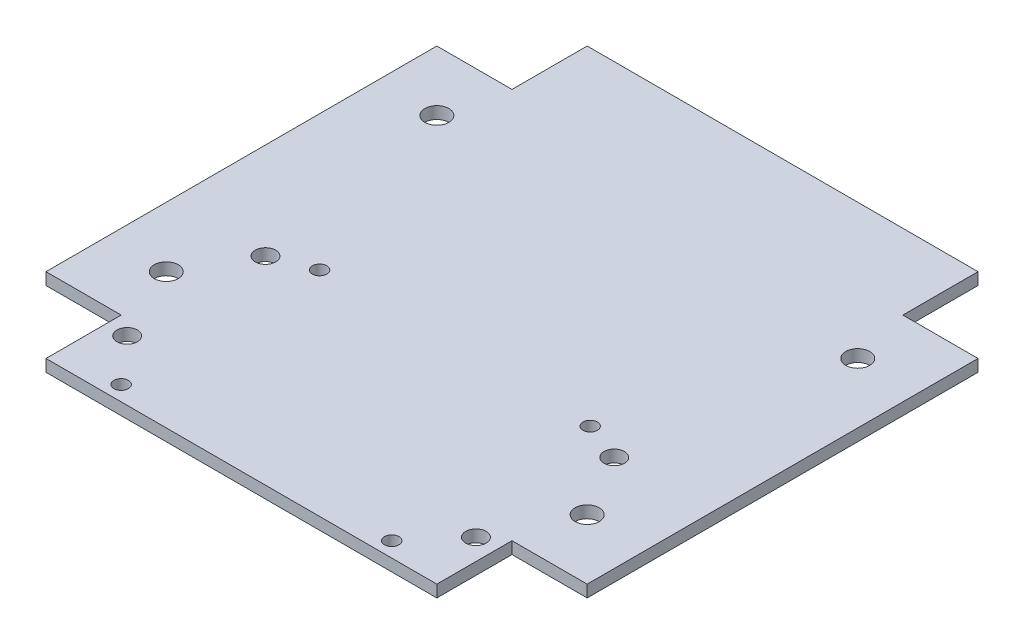
ISO-10303-21;
HEADER;
FILE_DESCRIPTION(('STEP AP214'),'2;1');
FILE_NAME('part.step','',(''),(''),'','','');
FILE_SCHEMA(('AUTOMOTIVE_DESIGN { 1 0 10303 214 1 1 1 1 }'));
ENDSEC;
DATA;
#1=APPLICATION_CONTEXT('core data for automotive mechanical design processes');
#2=APPLICATION_PROTOCOL_DEFINITION('international standard','automotive_design',2000,#1);
#3=PRODUCT_CONTEXT('',#1,'mechanical');
#4=PRODUCT('Part','Part','',(#3));
#5=PRODUCT_RELATED_PRODUCT_CATEGORY('part','',(#4));
#6=PRODUCT_DEFINITION_FORMATION('','',#4);
#7=PRODUCT_DEFINITION_CONTEXT('part definition',#1,'design');
#8=PRODUCT_DEFINITION('design','',#6,#7);
#9=PRODUCT_DEFINITION_SHAPE('','',#8);
#10=(LENGTH_UNIT() NAMED_UNIT(*) SI_UNIT(.MILLI.,.METRE.));
#11=(NAMED_UNIT(*) PLANE_ANGLE_UNIT() SI_UNIT($,.RADIAN.));
#12=(NAMED_UNIT(*) SI_UNIT($,.STERADIAN.) SOLID_ANGLE_UNIT());
#13=UNCERTAINTY_MEASURE_WITH_UNIT(LENGTH_MEASURE(1.E-05),#10,'distance_accuracy_value','');
#14=(GEOMETRIC_REPRESENTATION_CONTEXT(3) GLOBAL_UNCERTAINTY_ASSIGNED_CONTEXT((#13)) GLOBAL_UNIT_ASSIGNED_CONTEXT((#10,
#11,#12)) REPRESENTATION_CONTEXT('',''));
#15=CARTESIAN_POINT('',(0.,0.,0.));
#16=DIRECTION('',(0.,0.,1.));
#17=DIRECTION('',(1.,0.,0.));
#18=AXIS2_PLACEMENT_3D('',#15,#16,#17);
#19=CARTESIAN_POINT('',(0.,2.,0.));
#20=DIRECTION('',(0.,-1.,0.));
#21=DIRECTION('',(0.,0.,-1.));
#22=AXIS2_PLACEMENT_3D('',#19,#20,#21);
#23=PLANE('',#22);
#24=CARTESIAN_POINT('',(-31.4705882352941,2.,39.8897058823529));
#25=DIRECTION('',(0.,1.,0.));
#26=DIRECTION('',(0.,0.,1.));
#27=AXIS2_PLACEMENT_3D('',#24,#25,#26);
#28=CIRCLE('',#27,1.2);
#29=CARTESIAN_POINT('',(-31.4705882352941,2.,41.0897058823529));
#30=VERTEX_POINT('',#29);
#31=EDGE_CURVE('E231',#30,#30,#28,.T.);
#32=ORIENTED_EDGE('',*,*,#31,.F.);
#33=EDGE_LOOP('',(#32));
#34=FACE_BOUND('',#33,.T.);
#35=CARTESIAN_POINT('',(-31.4705882352941,2.,6.88970588235294));
#36=DIRECTION('',(0.,1.,0.));
#37=DIRECTION('',(0.,0.,1.));
#38=AXIS2_PLACEMENT_3D('',#35,#36,#37);
#39=CIRCLE('',#38,1.2);
#40=CARTESIAN_POINT('',(-31.4705882352941,2.,8.08970588235294));
#41=VERTEX_POINT('',#40);
#42=EDGE_CURVE('E221',#41,#41,#39,.T.);
#43=ORIENTED_EDGE('',*,*,#42,.F.);
#44=EDGE_LOOP('',(#43));
#45=FACE_BOUND('',#44,.T.);
#46=CARTESIAN_POINT('',(13.5294117647059,2.,39.8897058823529));
#47=DIRECTION('',(0.,1.,0.));
#48=DIRECTION('',(0.,0.,1.));
#49=AXIS2_PLACEMENT_3D('',#46,#47,#48);
#50=CIRCLE('',#49,1.2);
#51=CARTESIAN_POINT('',(13.5294117647059,2.,41.0897058823529));
#52=VERTEX_POINT('',#51);
#53=EDGE_CURVE('E218',#52,#52,#50,.T.);
#54=ORIENTED_EDGE('',*,*,#53,.F.);
#55=EDGE_LOOP('',(#54));
#56=FACE_BOUND('',#55,.T.);
#57=CARTESIAN_POINT('',(13.5294117647059,2.,6.88970588235294));
#58=DIRECTION('',(0.,1.,0.));
#59=DIRECTION('',(0.,0.,1.));
#60=AXIS2_PLACEMENT_3D('',#57,#58,#59);
#61=CIRCLE('',#60,1.2);
#62=CARTESIAN_POINT('',(13.5294117647059,2.,8.08970588235294));
#63=VERTEX_POINT('',#62);
#64=EDGE_CURVE('E215',#63,#63,#61,.T.);
#65=ORIENTED_EDGE('',*,*,#64,.F.);
#66=EDGE_LOOP('',(#65));
#67=FACE_BOUND('',#66,.T.);
#68=CARTESIAN_POINT('',(-37.9705882352941,2.,32.3897058823529));
#69=DIRECTION('',(0.,1.,0.));
#70=DIRECTION('',(0.,0.,1.));
#71=AXIS2_PLACEMENT_3D('',#68,#69,#70);
#72=CIRCLE('',#71,1.7);
#73=CARTESIAN_POINT('',(-37.9705882352941,2.,34.0897058823529));
#74=VERTEX_POINT('',#73);
#75=EDGE_CURVE('E210',#74,#74,#72,.T.);
#76=ORIENTED_EDGE('',*,*,#75,.F.);
#77=EDGE_LOOP('',(#76));
#78=FACE_BOUND('',#77,.T.);
#79=CARTESIAN_POINT('',(20.0294117647059,2.,32.3897058823529));
#80=DIRECTION('',(0.,1.,0.));
#81=DIRECTION('',(0.,0.,1.));
#82=AXIS2_PLACEMENT_3D('',#79,#80,#81);
#83=CIRCLE('',#82,1.7);
#84=CARTESIAN_POINT('',(20.0294117647059,2.,34.0897058823529));
#85=VERTEX_POINT('',#84);
#86=EDGE_CURVE('E243',#85,#85,#83,.T.);
#87=ORIENTED_EDGE('',*,*,#86,.F.);
#88=EDGE_LOOP('',(#87));
#89=FACE_BOUND('',#88,.T.);
#90=CARTESIAN_POINT('',(20.0294117647059,2.,9.38970588235295));
#91=DIRECTION('',(0.,1.,0.));
#92=DIRECTION('',(0.,0.,1.));
#93=AXIS2_PLACEMENT_3D('',#90,#91,#92);
#94=CIRCLE('',#93,1.7);
#95=CARTESIAN_POINT('',(20.0294117647059,2.,11.0897058823529));
#96=VERTEX_POINT('',#95);
#97=EDGE_CURVE('E206',#96,#96,#94,.T.);
#98=ORIENTED_EDGE('',*,*,#97,.F.);
#99=EDGE_LOOP('',(#98));
#100=FACE_BOUND('',#99,.T.);
#101=CARTESIAN_POINT('',(-43.9705882352941,2.,-25.1102941176471));
#102=DIRECTION('',(0.,1.,0.));
#103=DIRECTION('',(0.,0.,1.));
#104=AXIS2_PLACEMENT_3D('',#101,#102,#103);
#105=CIRCLE('',#104,1.99999999999999);
#106=CARTESIAN_POINT('',(-43.9705882352941,2.,-23.1102941176471));
#107=VERTEX_POINT('',#106);
#108=EDGE_CURVE('E205',#107,#107,#105,.T.);
#109=ORIENTED_EDGE('',*,*,#108,.F.);
#110=EDGE_LOOP('',(#109));
#111=FACE_BOUND('',#110,.T.);
#112=CARTESIAN_POINT('',(26.0294117647059,2.,-25.1102941176471));
#113=DIRECTION('',(0.,1.,0.));
#114=DIRECTION('',(0.,0.,1.));
#115=AXIS2_PLACEMENT_3D('',#112,#113,#114);
#116=CIRCLE('',#115,1.99999999999999);
#117=CARTESIAN_POINT('',(26.0294117647059,2.,-23.1102941176471));
#118=VERTEX_POINT('',#117);
#119=EDGE_CURVE('E256',#118,#118,#116,.T.);
#120=ORIENTED_EDGE('',*,*,#119,.F.);
#121=EDGE_LOOP('',(#120));
#122=FACE_BOUND('',#121,.T.);
#123=CARTESIAN_POINT('',(-43.9705882352941,2.,19.8897058823529));
#124=DIRECTION('',(0.,1.,0.));
#125=DIRECTION('',(0.,0.,1.));
#126=AXIS2_PLACEMENT_3D('',#123,#124,#125);
#127=CIRCLE('',#126,1.99999999999999);
#128=CARTESIAN_POINT('',(-43.9705882352941,2.,21.8897058823529));
#129=VERTEX_POINT('',#128);
#130=EDGE_CURVE('E262',#129,#129,#127,.T.);
#131=ORIENTED_EDGE('',*,*,#130,.F.);
#132=EDGE_LOOP('',(#131));
#133=FACE_BOUND('',#132,.T.);
#134=DIRECTION('',(0.,0.,1.));
#135=VECTOR('',#134,1.);
#136=CARTESIAN_POINT('',(-53.9705882352941,2.,29.8897058823529));
#137=LINE('',#136,#135);
#138=CARTESIAN_POINT('',(-53.9705882352941,2.,-35.1102941176471));
#139=VERTEX_POINT('',#138);
#140=CARTESIAN_POINT('',(-53.9705882352941,2.,29.8897058823529));
#141=VERTEX_POINT('',#140);
#142=EDGE_CURVE('E178',#139,#141,#137,.T.);
#143=ORIENTED_EDGE('',*,*,#142,.T.);
#144=DIRECTION('',(1.,0.,0.));
#145=VECTOR('',#144,1.);
#146=CARTESIAN_POINT('',(-41.4705882352941,2.,29.8897058823529));
#147=LINE('',#146,#145);
#148=CARTESIAN_POINT('',(-41.4705882352941,2.,29.8897058823529));
#149=VERTEX_POINT('',#148);
#150=EDGE_CURVE('E106',#141,#149,#147,.T.);
#151=ORIENTED_EDGE('',*,*,#150,.T.);
#152=DIRECTION('',(0.,0.,1.));
#153=VECTOR('',#152,1.);
#154=CARTESIAN_POINT('',(-41.4705882352941,2.,42.3897058823529));
#155=LINE('',#154,#153);
#156=CARTESIAN_POINT('',(-41.4705882352941,2.,42.3897058823529));
#157=VERTEX_POINT('',#156);
#158=EDGE_CURVE('E275',#149,#157,#155,.T.);
#159=ORIENTED_EDGE('',*,*,#158,.T.);
#160=DIRECTION('',(1.,0.,0.));
#161=VECTOR('',#160,1.);
#162=CARTESIAN_POINT('',(23.5294117647059,2.,42.3897058823529));
#163=LINE('',#162,#161);
#164=CARTESIAN_POINT('',(23.5294117647059,2.,42.3897058823529));
#165=VERTEX_POINT('',#164);
#166=EDGE_CURVE('E277',#157,#165,#163,.T.);
#167=ORIENTED_EDGE('',*,*,#166,.T.);
#168=DIRECTION('',(0.,0.,-1.));
#169=VECTOR('',#168,1.);
#170=CARTESIAN_POINT('',(23.5294117647059,2.,29.8897058823529));
#171=LINE('',#170,#169);
#172=CARTESIAN_POINT('',(23.5294117647059,2.,29.8897058823529));
#173=VERTEX_POINT('',#172);
#174=EDGE_CURVE('E279',#165,#173,#171,.T.);
#175=ORIENTED_EDGE('',*,*,#174,.T.);
#176=DIRECTION('',(1.,0.,0.));
#177=VECTOR('',#176,1.);
#178=CARTESIAN_POINT('',(36.0294117647059,2.,29.8897058823529));
#179=LINE('',#178,#177);
#180=CARTESIAN_POINT('',(36.0294117647059,2.,29.8897058823529));
#181=VERTEX_POINT('',#180);
#182=EDGE_CURVE('E281',#173,#181,#179,.T.);
#183=ORIENTED_EDGE('',*,*,#182,.T.);
#184=DIRECTION('',(0.,0.,-1.));
#185=VECTOR('',#184,1.);
#186=CARTESIAN_POINT('',(36.0294117647059,2.,-35.1102941176471));
#187=LINE('',#186,#185);
#188=CARTESIAN_POINT('',(36.0294117647059,2.,-35.1102941176471));
#189=VERTEX_POINT('',#188);
#190=EDGE_CURVE('E283',#181,#189,#187,.T.);
#191=ORIENTED_EDGE('',*,*,#190,.T.);
#192=DIRECTION('',(-1.,0.,0.));
#193=VECTOR('',#192,1.);
#194=CARTESIAN_POINT('',(23.5294117647059,2.,-35.1102941176471));
#195=LINE('',#194,#193);
#196=CARTESIAN_POINT('',(23.5294117647059,2.,-35.1102941176471));
#197=VERTEX_POINT('',#196);
#198=EDGE_CURVE('E285',#189,#197,#195,.T.);
#199=ORIENTED_EDGE('',*,*,#198,.T.);
#200=DIRECTION('',(0.,0.,-1.));
#201=VECTOR('',#200,1.);
#202=CARTESIAN_POINT('',(23.5294117647059,2.,-47.6102941176471));
#203=LINE('',#202,#201);
#204=CARTESIAN_POINT('',(23.5294117647059,2.,-47.6102941176471));
#205=VERTEX_POINT('',#204);
#206=EDGE_CURVE('E137',#197,#205,#203,.T.);
#207=ORIENTED_EDGE('',*,*,#206,.T.);
#208=DIRECTION('',(-1.,0.,0.));
#209=VECTOR('',#208,1.);
#210=CARTESIAN_POINT('',(-41.4705882352941,2.,-47.6102941176471));
#211=LINE('',#210,#209);
#212=CARTESIAN_POINT('',(-41.4705882352941,2.,-47.6102941176471));
#213=VERTEX_POINT('',#212);
#214=EDGE_CURVE('E131',#205,#213,#211,.T.);
#215=ORIENTED_EDGE('',*,*,#214,.T.);
#216=DIRECTION('',(0.,0.,1.));
#217=VECTOR('',#216,1.);
#218=CARTESIAN_POINT('',(-41.4705882352941,2.,-35.1102941176471));
#219=LINE('',#218,#217);
#220=CARTESIAN_POINT('',(-41.4705882352941,2.,-35.1102941176471));
#221=VERTEX_POINT('',#220);
#222=EDGE_CURVE('E135',#213,#221,#219,.T.);
#223=ORIENTED_EDGE('',*,*,#222,.T.);
#224=DIRECTION('',(-1.,0.,0.));
#225=VECTOR('',#224,1.);
#226=CARTESIAN_POINT('',(-53.9705882352941,2.,-35.1102941176471));
#227=LINE('',#226,#225);
#228=EDGE_CURVE('E51',#221,#139,#227,.T.);
#229=ORIENTED_EDGE('',*,*,#228,.T.);
#230=EDGE_LOOP('',(#143,#151,#159,#167,#175,#183,#191,#199,#207,#215,#223,#229));
#231=FACE_BOUND('',#230,.T.);
#232=CARTESIAN_POINT('',(26.0294117647059,2.,19.8897058823529));
#233=DIRECTION('',(0.,1.,0.));
#234=DIRECTION('',(0.,0.,1.));
#235=AXIS2_PLACEMENT_3D('',#232,#233,#234);
#236=CIRCLE('',#235,1.99999999999999);
#237=CARTESIAN_POINT('',(26.0294117647059,2.,21.8897058823529));
#238=VERTEX_POINT('',#237);
#239=EDGE_CURVE('E268',#238,#238,#236,.T.);
#240=ORIENTED_EDGE('',*,*,#239,.F.);
#241=EDGE_LOOP('',(#240));
#242=FACE_BOUND('',#241,.T.);
#243=CARTESIAN_POINT('',(-37.9705882352941,2.,9.38970588235295));
#244=DIRECTION('',(0.,1.,0.));
#245=DIRECTION('',(0.,0.,1.));
#246=AXIS2_PLACEMENT_3D('',#243,#244,#245);
#247=CIRCLE('',#246,1.7);
#248=CARTESIAN_POINT('',(-37.9705882352941,2.,11.0897058823529));
#249=VERTEX_POINT('',#248);
#250=EDGE_CURVE('E211',#249,#249,#247,.T.);
#251=ORIENTED_EDGE('',*,*,#250,.F.);
#252=EDGE_LOOP('',(#251));
#253=FACE_BOUND('',#252,.T.);
#254=ADVANCED_FACE('F32',(#34,#45,#56,#67,#78,#89,#100,#111,#122,#133,#231,#242,#253),#23,.F.);
#255=CARTESIAN_POINT('',(-53.9705882352941,2.,29.8897058823529));
#256=DIRECTION('',(1.,0.,0.));
#257=DIRECTION('',(0.,0.,-1.));
#258=AXIS2_PLACEMENT_3D('',#255,#256,#257);
#259=PLANE('',#258);
#260=DIRECTION('',(0.,0.,1.));
#261=VECTOR('',#260,1.);
#262=CARTESIAN_POINT('',(-53.9705882352941,0.,29.8897058823529));
#263=LINE('',#262,#261);
#264=CARTESIAN_POINT('',(-53.9705882352941,0.,-35.1102941176471));
#265=VERTEX_POINT('',#264);
#266=CARTESIAN_POINT('',(-53.9705882352941,0.,29.8897058823529));
#267=VERTEX_POINT('',#266);
#268=EDGE_CURVE('E155',#265,#267,#263,.T.);
#269=ORIENTED_EDGE('',*,*,#268,.T.);
#270=DIRECTION('',(0.,-1.,0.));
#271=VECTOR('',#270,1.);
#272=CARTESIAN_POINT('',(-53.9705882352941,2.,29.8897058823529));
#273=LINE('',#272,#271);
#274=EDGE_CURVE('E11',#141,#267,#273,.T.);
#275=ORIENTED_EDGE('',*,*,#274,.F.);
#276=ORIENTED_EDGE('',*,*,#142,.F.);
#277=DIRECTION('',(0.,-1.,0.));
#278=VECTOR('',#277,1.);
#279=CARTESIAN_POINT('',(-53.9705882352941,2.,-35.1102941176471));
#280=LINE('',#279,#278);
#281=EDGE_CURVE('E151',#139,#265,#280,.T.);
#282=ORIENTED_EDGE('',*,*,#281,.T.);
#283=EDGE_LOOP('',(#269,#275,#276,#282));
#284=FACE_BOUND('',#283,.T.);
#285=ADVANCED_FACE('F34',(#284),#259,.F.);
#286=CARTESIAN_POINT('',(-41.4705882352941,2.,29.8897058823529));
#287=DIRECTION('',(0.,0.,-1.));
#288=DIRECTION('',(-1.,0.,0.));
#289=AXIS2_PLACEMENT_3D('',#286,#287,#288);
#290=PLANE('',#289);
#291=DIRECTION('',(1.,0.,0.));
#292=VECTOR('',#291,1.);
#293=CARTESIAN_POINT('',(-41.4705882352941,0.,29.8897058823529));
#294=LINE('',#293,#292);
#295=CARTESIAN_POINT('',(-41.4705882352941,0.,29.8897058823529));
#296=VERTEX_POINT('',#295);
#297=EDGE_CURVE('E158',#267,#296,#294,.T.);
#298=ORIENTED_EDGE('',*,*,#297,.T.);
#299=DIRECTION('',(0.,-1.,0.));
#300=VECTOR('',#299,1.);
#301=CARTESIAN_POINT('',(-41.4705882352941,2.,29.8897058823529));
#302=LINE('',#301,#300);
#303=EDGE_CURVE('E42',#149,#296,#302,.T.);
#304=ORIENTED_EDGE('',*,*,#303,.F.);
#305=ORIENTED_EDGE('',*,*,#150,.F.);
#306=ORIENTED_EDGE('',*,*,#274,.T.);
#307=EDGE_LOOP('',(#298,#304,#305,#306));
#308=FACE_BOUND('',#307,.T.);
#309=ADVANCED_FACE('F320',(#308),#290,.F.);
#310=CARTESIAN_POINT('',(-41.4705882352941,2.,42.3897058823529));
#311=DIRECTION('',(1.,0.,0.));
#312=DIRECTION('',(0.,0.,-1.));
#313=AXIS2_PLACEMENT_3D('',#310,#311,#312);
#314=PLANE('',#313);
#315=DIRECTION('',(0.,0.,1.));
#316=VECTOR('',#315,1.);
#317=CARTESIAN_POINT('',(-41.4705882352941,0.,42.3897058823529));
#318=LINE('',#317,#316);
#319=CARTESIAN_POINT('',(-41.4705882352941,0.,42.3897058823529));
#320=VERTEX_POINT('',#319);
#321=EDGE_CURVE('E161',#296,#320,#318,.T.);
#322=ORIENTED_EDGE('',*,*,#321,.T.);
#323=DIRECTION('',(0.,-1.,0.));
#324=VECTOR('',#323,1.);
#325=CARTESIAN_POINT('',(-41.4705882352941,2.,42.3897058823529));
#326=LINE('',#325,#324);
#327=EDGE_CURVE('E197',#157,#320,#326,.T.);
#328=ORIENTED_EDGE('',*,*,#327,.F.);
#329=ORIENTED_EDGE('',*,*,#158,.F.);
#330=ORIENTED_EDGE('',*,*,#303,.T.);
#331=EDGE_LOOP('',(#322,#328,#329,#330));
#332=FACE_BOUND('',#331,.T.);
#333=ADVANCED_FACE('F568',(#332),#314,.F.);
#334=CARTESIAN_POINT('',(23.5294117647059,2.,42.3897058823529));
#335=DIRECTION('',(0.,0.,-1.));
#336=DIRECTION('',(-1.,0.,0.));
#337=AXIS2_PLACEMENT_3D('',#334,#335,#336);
#338=PLANE('',#337);
#339=DIRECTION('',(1.,0.,0.));
#340=VECTOR('',#339,1.);
#341=CARTESIAN_POINT('',(23.5294117647059,0.,42.3897058823529));
#342=LINE('',#341,#340);
#343=CARTESIAN_POINT('',(23.5294117647059,0.,42.3897058823529));
#344=VERTEX_POINT('',#343);
#345=EDGE_CURVE('E163',#320,#344,#342,.T.);
#346=ORIENTED_EDGE('',*,*,#345,.T.);
#347=DIRECTION('',(0.,-1.,0.));
#348=VECTOR('',#347,1.);
#349=CARTESIAN_POINT('',(23.5294117647059,2.,42.3897058823529));
#350=LINE('',#349,#348);
#351=EDGE_CURVE('E194',#165,#344,#350,.T.);
#352=ORIENTED_EDGE('',*,*,#351,.F.);
#353=ORIENTED_EDGE('',*,*,#166,.F.);
#354=ORIENTED_EDGE('',*,*,#327,.T.);
#355=EDGE_LOOP('',(#346,#352,#353,#354));
#356=FACE_BOUND('',#355,.T.);
#357=ADVANCED_FACE('F559',(#356),#338,.F.);
#358=CARTESIAN_POINT('',(23.5294117647059,2.,29.8897058823529));
#359=DIRECTION('',(-1.,0.,0.));
#360=DIRECTION('',(0.,0.,1.));
#361=AXIS2_PLACEMENT_3D('',#358,#359,#360);
#362=PLANE('',#361);
#363=DIRECTION('',(0.,0.,-1.));
#364=VECTOR('',#363,1.);
#365=CARTESIAN_POINT('',(23.5294117647059,0.,29.8897058823529));
#366=LINE('',#365,#364);
#367=CARTESIAN_POINT('',(23.5294117647059,0.,29.8897058823529));
#368=VERTEX_POINT('',#367);
#369=EDGE_CURVE('E165',#344,#368,#366,.T.);
#370=ORIENTED_EDGE('',*,*,#369,.T.);
#371=DIRECTION('',(0.,-1.,0.));
#372=VECTOR('',#371,1.);
#373=CARTESIAN_POINT('',(23.5294117647059,2.,29.8897058823529));
#374=LINE('',#373,#372);
#375=EDGE_CURVE('E191',#173,#368,#374,.T.);
#376=ORIENTED_EDGE('',*,*,#375,.F.);
#377=ORIENTED_EDGE('',*,*,#174,.F.);
#378=ORIENTED_EDGE('',*,*,#351,.T.);
#379=EDGE_LOOP('',(#370,#376,#377,#378));
#380=FACE_BOUND('',#379,.T.);
#381=ADVANCED_FACE('F550',(#380),#362,.F.);
#382=CARTESIAN_POINT('',(36.0294117647059,2.,29.8897058823529));
#383=DIRECTION('',(0.,0.,-1.));
#384=DIRECTION('',(-1.,0.,0.));
#385=AXIS2_PLACEMENT_3D('',#382,#383,#384);
#386=PLANE('',#385);
#387=DIRECTION('',(1.,0.,0.));
#388=VECTOR('',#387,1.);
#389=CARTESIAN_POINT('',(36.0294117647059,0.,29.8897058823529));
#390=LINE('',#389,#388);
#391=CARTESIAN_POINT('',(36.0294117647059,0.,29.8897058823529));
#392=VERTEX_POINT('',#391);
#393=EDGE_CURVE('E167',#368,#392,#390,.T.);
#394=ORIENTED_EDGE('',*,*,#393,.T.);
#395=DIRECTION('',(0.,-1.,0.));
#396=VECTOR('',#395,1.);
#397=CARTESIAN_POINT('',(36.0294117647059,2.,29.8897058823529));
#398=LINE('',#397,#396);
#399=EDGE_CURVE('E188',#181,#392,#398,.T.);
#400=ORIENTED_EDGE('',*,*,#399,.F.);
#401=ORIENTED_EDGE('',*,*,#182,.F.);
#402=ORIENTED_EDGE('',*,*,#375,.T.);
#403=EDGE_LOOP('',(#394,#400,#401,#402));
#404=FACE_BOUND('',#403,.T.);
#405=ADVANCED_FACE('F541',(#404),#386,.F.);
#406=CARTESIAN_POINT('',(36.0294117647059,2.,-35.1102941176471));
#407=DIRECTION('',(-1.,0.,0.));
#408=DIRECTION('',(0.,0.,1.));
#409=AXIS2_PLACEMENT_3D('',#406,#407,#408);
#410=PLANE('',#409);
#411=DIRECTION('',(0.,0.,-1.));
#412=VECTOR('',#411,1.);
#413=CARTESIAN_POINT('',(36.0294117647059,0.,-35.1102941176471));
#414=LINE('',#413,#412);
#415=CARTESIAN_POINT('',(36.0294117647059,0.,-35.1102941176471));
#416=VERTEX_POINT('',#415);
#417=EDGE_CURVE('E169',#392,#416,#414,.T.);
#418=ORIENTED_EDGE('',*,*,#417,.T.);
#419=DIRECTION('',(0.,-1.,0.));
#420=VECTOR('',#419,1.);
#421=CARTESIAN_POINT('',(36.0294117647059,2.,-35.1102941176471));
#422=LINE('',#421,#420);
#423=EDGE_CURVE('E185',#189,#416,#422,.T.);
#424=ORIENTED_EDGE('',*,*,#423,.F.);
#425=ORIENTED_EDGE('',*,*,#190,.F.);
#426=ORIENTED_EDGE('',*,*,#399,.T.);
#427=EDGE_LOOP('',(#418,#424,#425,#426));
#428=FACE_BOUND('',#427,.T.);
#429=ADVANCED_FACE('F533',(#428),#410,.F.);
#430=CARTESIAN_POINT('',(23.5294117647059,2.,-35.1102941176471));
#431=DIRECTION('',(0.,0.,1.));
#432=DIRECTION('',(1.,0.,0.));
#433=AXIS2_PLACEMENT_3D('',#430,#431,#432);
#434=PLANE('',#433);
#435=DIRECTION('',(-1.,0.,0.));
#436=VECTOR('',#435,1.);
#437=CARTESIAN_POINT('',(23.5294117647059,0.,-35.1102941176471));
#438=LINE('',#437,#436);
#439=CARTESIAN_POINT('',(23.5294117647059,0.,-35.1102941176471));
#440=VERTEX_POINT('',#439);
#441=EDGE_CURVE('E171',#416,#440,#438,.T.);
#442=ORIENTED_EDGE('',*,*,#441,.T.);
#443=DIRECTION('',(0.,-1.,0.));
#444=VECTOR('',#443,1.);
#445=CARTESIAN_POINT('',(23.5294117647059,2.,-35.1102941176471));
#446=LINE('',#445,#444);
#447=EDGE_CURVE('E182',#197,#440,#446,.T.);
#448=ORIENTED_EDGE('',*,*,#447,.F.);
#449=ORIENTED_EDGE('',*,*,#198,.F.);
#450=ORIENTED_EDGE('',*,*,#423,.T.);
#451=EDGE_LOOP('',(#442,#448,#449,#450));
#452=FACE_BOUND('',#451,.T.);
#453=ADVANCED_FACE('F291',(#452),#434,.F.);
#454=CARTESIAN_POINT('',(23.5294117647059,2.,-47.6102941176471));
#455=DIRECTION('',(-1.,0.,0.));
#456=DIRECTION('',(0.,0.,1.));
#457=AXIS2_PLACEMENT_3D('',#454,#455,#456);
#458=PLANE('',#457);
#459=DIRECTION('',(0.,0.,-1.));
#460=VECTOR('',#459,1.);
#461=CARTESIAN_POINT('',(23.5294117647059,0.,-47.6102941176471));
#462=LINE('',#461,#460);
#463=CARTESIAN_POINT('',(23.5294117647059,0.,-47.6102941176471));
#464=VERTEX_POINT('',#463);
#465=EDGE_CURVE('E173',#440,#464,#462,.T.);
#466=ORIENTED_EDGE('',*,*,#465,.T.);
#467=DIRECTION('',(0.,-1.,0.));
#468=VECTOR('',#467,1.);
#469=CARTESIAN_POINT('',(23.5294117647059,2.,-47.6102941176471));
#470=LINE('',#469,#468);
#471=EDGE_CURVE('E146',#205,#464,#470,.T.);
#472=ORIENTED_EDGE('',*,*,#471,.F.);
#473=ORIENTED_EDGE('',*,*,#206,.F.);
#474=ORIENTED_EDGE('',*,*,#447,.T.);
#475=EDGE_LOOP('',(#466,#472,#473,#474));
#476=FACE_BOUND('',#475,.T.);
#477=ADVANCED_FACE('F295',(#476),#458,.F.);
#478=CARTESIAN_POINT('',(-41.4705882352941,2.,-47.6102941176471));
#479=DIRECTION('',(0.,0.,1.));
#480=DIRECTION('',(1.,0.,0.));
#481=AXIS2_PLACEMENT_3D('',#478,#479,#480);
#482=PLANE('',#481);
#483=DIRECTION('',(-1.,0.,0.));
#484=VECTOR('',#483,1.);
#485=CARTESIAN_POINT('',(-41.4705882352941,0.,-47.6102941176471));
#486=LINE('',#485,#484);
#487=CARTESIAN_POINT('',(-41.4705882352941,0.,-47.6102941176471));
#488=VERTEX_POINT('',#487);
#489=EDGE_CURVE('E145',#464,#488,#486,.T.);
#490=ORIENTED_EDGE('',*,*,#489,.T.);
#491=DIRECTION('',(0.,-1.,0.));
#492=VECTOR('',#491,1.);
#493=CARTESIAN_POINT('',(-41.4705882352941,2.,-47.6102941176471));
#494=LINE('',#493,#492);
#495=EDGE_CURVE('E142',#213,#488,#494,.T.);
#496=ORIENTED_EDGE('',*,*,#495,.F.);
#497=ORIENTED_EDGE('',*,*,#214,.F.);
#498=ORIENTED_EDGE('',*,*,#471,.T.);
#499=EDGE_LOOP('',(#490,#496,#497,#498));
#500=FACE_BOUND('',#499,.T.);
#501=ADVANCED_FACE('F143',(#500),#482,.F.);
#502=CARTESIAN_POINT('',(-41.4705882352941,2.,-35.1102941176471));
#503=DIRECTION('',(1.,0.,0.));
#504=DIRECTION('',(0.,0.,-1.));
#505=AXIS2_PLACEMENT_3D('',#502,#503,#504);
#506=PLANE('',#505);
#507=DIRECTION('',(0.,0.,1.));
#508=VECTOR('',#507,1.);
#509=CARTESIAN_POINT('',(-41.4705882352941,0.,-35.1102941176471));
#510=LINE('',#509,#508);
#511=CARTESIAN_POINT('',(-41.4705882352941,0.,-35.1102941176471));
#512=VERTEX_POINT('',#511);
#513=EDGE_CURVE('E92',#488,#512,#510,.T.);
#514=ORIENTED_EDGE('',*,*,#513,.T.);
#515=DIRECTION('',(0.,-1.,0.));
#516=VECTOR('',#515,1.);
#517=CARTESIAN_POINT('',(-41.4705882352941,2.,-35.1102941176471));
#518=LINE('',#517,#516);
#519=EDGE_CURVE('E147',#221,#512,#518,.T.);
#520=ORIENTED_EDGE('',*,*,#519,.F.);
#521=ORIENTED_EDGE('',*,*,#222,.F.);
#522=ORIENTED_EDGE('',*,*,#495,.T.);
#523=EDGE_LOOP('',(#514,#520,#521,#522));
#524=FACE_BOUND('',#523,.T.);
#525=ADVANCED_FACE('F149',(#524),#506,.F.);
#526=CARTESIAN_POINT('',(-53.9705882352941,2.,-35.1102941176471));
#527=DIRECTION('',(0.,0.,1.));
#528=DIRECTION('',(1.,0.,0.));
#529=AXIS2_PLACEMENT_3D('',#526,#527,#528);
#530=PLANE('',#529);
#531=DIRECTION('',(-1.,0.,0.));
#532=VECTOR('',#531,1.);
#533=CARTESIAN_POINT('',(-53.9705882352941,0.,-35.1102941176471));
#534=LINE('',#533,#532);
#535=EDGE_CURVE('E98',#512,#265,#534,.T.);
#536=ORIENTED_EDGE('',*,*,#535,.T.);
#537=ORIENTED_EDGE('',*,*,#281,.F.);
#538=ORIENTED_EDGE('',*,*,#228,.F.);
#539=ORIENTED_EDGE('',*,*,#519,.T.);
#540=EDGE_LOOP('',(#536,#537,#538,#539));
#541=FACE_BOUND('',#540,.T.);
#542=ADVANCED_FACE('F303',(#541),#530,.F.);
#543=CARTESIAN_POINT('',(0.,0.,0.));
#544=DIRECTION('',(0.,-1.,0.));
#545=DIRECTION('',(0.,0.,-1.));
#546=AXIS2_PLACEMENT_3D('',#543,#544,#545);
#547=PLANE('',#546);
#548=CARTESIAN_POINT('',(-31.4705882352941,0.,39.8897058823529));
#549=DIRECTION('',(0.,-1.,0.));
#550=DIRECTION('',(0.,0.,-1.));
#551=AXIS2_PLACEMENT_3D('',#548,#549,#550);
#552=CIRCLE('',#551,1.2);
#553=CARTESIAN_POINT('',(-31.4705882352941,0.,38.6897058823529));
#554=VERTEX_POINT('',#553);
#555=EDGE_CURVE('E36',#554,#554,#552,.T.);
#556=ORIENTED_EDGE('',*,*,#555,.F.);
#557=EDGE_LOOP('',(#556));
#558=FACE_BOUND('',#557,.T.);
#559=CARTESIAN_POINT('',(-31.4705882352941,0.,6.88970588235294));
#560=DIRECTION('',(0.,-1.,0.));
#561=DIRECTION('',(0.,0.,-1.));
#562=AXIS2_PLACEMENT_3D('',#559,#560,#561);
#563=CIRCLE('',#562,1.2);
#564=CARTESIAN_POINT('',(-31.4705882352941,0.,5.68970588235294));
#565=VERTEX_POINT('',#564);
#566=EDGE_CURVE('E219',#565,#565,#563,.T.);
#567=ORIENTED_EDGE('',*,*,#566,.F.);
#568=EDGE_LOOP('',(#567));
#569=FACE_BOUND('',#568,.T.);
#570=CARTESIAN_POINT('',(13.5294117647059,0.,39.8897058823529));
#571=DIRECTION('',(0.,-1.,0.));
#572=DIRECTION('',(0.,0.,-1.));
#573=AXIS2_PLACEMENT_3D('',#570,#571,#572);
#574=CIRCLE('',#573,1.2);
#575=CARTESIAN_POINT('',(13.5294117647059,0.,38.6897058823529));
#576=VERTEX_POINT('',#575);
#577=EDGE_CURVE('E216',#576,#576,#574,.T.);
#578=ORIENTED_EDGE('',*,*,#577,.F.);
#579=EDGE_LOOP('',(#578));
#580=FACE_BOUND('',#579,.T.);
#581=CARTESIAN_POINT('',(13.5294117647059,0.,6.88970588235294));
#582=DIRECTION('',(0.,-1.,0.));
#583=DIRECTION('',(0.,0.,-1.));
#584=AXIS2_PLACEMENT_3D('',#581,#582,#583);
#585=CIRCLE('',#584,1.2);
#586=CARTESIAN_POINT('',(13.5294117647059,0.,5.68970588235294));
#587=VERTEX_POINT('',#586);
#588=EDGE_CURVE('E212',#587,#587,#585,.T.);
#589=ORIENTED_EDGE('',*,*,#588,.F.);
#590=EDGE_LOOP('',(#589));
#591=FACE_BOUND('',#590,.T.);
#592=CARTESIAN_POINT('',(-37.9705882352941,0.,9.38970588235295));
#593=DIRECTION('',(0.,-1.,0.));
#594=DIRECTION('',(0.,0.,-1.));
#595=AXIS2_PLACEMENT_3D('',#592,#593,#594);
#596=CIRCLE('',#595,1.7);
#597=CARTESIAN_POINT('',(-37.9705882352941,0.,7.68970588235295));
#598=VERTEX_POINT('',#597);
#599=EDGE_CURVE('E207',#598,#598,#596,.T.);
#600=ORIENTED_EDGE('',*,*,#599,.F.);
#601=EDGE_LOOP('',(#600));
#602=FACE_BOUND('',#601,.T.);
#603=CARTESIAN_POINT('',(-37.9705882352941,0.,32.3897058823529));
#604=DIRECTION('',(0.,-1.,0.));
#605=DIRECTION('',(0.,0.,-1.));
#606=AXIS2_PLACEMENT_3D('',#603,#604,#605);
#607=CIRCLE('',#606,1.7);
#608=CARTESIAN_POINT('',(-37.9705882352941,0.,30.6897058823529));
#609=VERTEX_POINT('',#608);
#610=EDGE_CURVE('E240',#609,#609,#607,.T.);
#611=ORIENTED_EDGE('',*,*,#610,.F.);
#612=EDGE_LOOP('',(#611));
#613=FACE_BOUND('',#612,.T.);
#614=CARTESIAN_POINT('',(20.0294117647059,0.,32.3897058823529));
#615=DIRECTION('',(0.,-1.,0.));
#616=DIRECTION('',(0.,0.,-1.));
#617=AXIS2_PLACEMENT_3D('',#614,#615,#616);
#618=CIRCLE('',#617,1.7);
#619=CARTESIAN_POINT('',(20.0294117647059,0.,30.6897058823529));
#620=VERTEX_POINT('',#619);
#621=EDGE_CURVE('E246',#620,#620,#618,.T.);
#622=ORIENTED_EDGE('',*,*,#621,.F.);
#623=EDGE_LOOP('',(#622));
#624=FACE_BOUND('',#623,.T.);
#625=CARTESIAN_POINT('',(20.0294117647059,0.,9.38970588235295));
#626=DIRECTION('',(0.,-1.,0.));
#627=DIRECTION('',(0.,0.,-1.));
#628=AXIS2_PLACEMENT_3D('',#625,#626,#627);
#629=CIRCLE('',#628,1.7);
#630=CARTESIAN_POINT('',(20.0294117647059,0.,7.68970588235295));
#631=VERTEX_POINT('',#630);
#632=EDGE_CURVE('E202',#631,#631,#629,.T.);
#633=ORIENTED_EDGE('',*,*,#632,.F.);
#634=EDGE_LOOP('',(#633));
#635=FACE_BOUND('',#634,.T.);
#636=CARTESIAN_POINT('',(-43.9705882352941,0.,-25.1102941176471));
#637=DIRECTION('',(0.,1.,0.));
#638=DIRECTION('',(0.,0.,1.));
#639=AXIS2_PLACEMENT_3D('',#636,#637,#638);
#640=CIRCLE('',#639,2.);
#641=CARTESIAN_POINT('',(-43.9705882352941,0.,-23.1102941176471));
#642=VERTEX_POINT('',#641);
#643=EDGE_CURVE('E253',#642,#642,#640,.T.);
#644=ORIENTED_EDGE('',*,*,#643,.T.);
#645=EDGE_LOOP('',(#644));
#646=FACE_BOUND('',#645,.T.);
#647=CARTESIAN_POINT('',(26.0294117647059,0.,-25.1102941176471));
#648=DIRECTION('',(0.,1.,0.));
#649=DIRECTION('',(0.,0.,1.));
#650=AXIS2_PLACEMENT_3D('',#647,#648,#649);
#651=CIRCLE('',#650,2.);
#652=CARTESIAN_POINT('',(26.0294117647059,0.,-23.1102941176471));
#653=VERTEX_POINT('',#652);
#654=EDGE_CURVE('E259',#653,#653,#651,.T.);
#655=ORIENTED_EDGE('',*,*,#654,.T.);
#656=EDGE_LOOP('',(#655));
#657=FACE_BOUND('',#656,.T.);
#658=CARTESIAN_POINT('',(-43.9705882352941,0.,19.8897058823529));
#659=DIRECTION('',(0.,1.,0.));
#660=DIRECTION('',(0.,0.,1.));
#661=AXIS2_PLACEMENT_3D('',#658,#659,#660);
#662=CIRCLE('',#661,2.);
#663=CARTESIAN_POINT('',(-43.9705882352941,0.,21.8897058823529));
#664=VERTEX_POINT('',#663);
#665=EDGE_CURVE('E265',#664,#664,#662,.T.);
#666=ORIENTED_EDGE('',*,*,#665,.T.);
#667=EDGE_LOOP('',(#666));
#668=FACE_BOUND('',#667,.T.);
#669=CARTESIAN_POINT('',(26.0294117647059,0.,19.8897058823529));
#670=DIRECTION('',(0.,1.,0.));
#671=DIRECTION('',(0.,0.,1.));
#672=AXIS2_PLACEMENT_3D('',#669,#670,#671);
#673=CIRCLE('',#672,2.);
#674=CARTESIAN_POINT('',(26.0294117647059,0.,21.8897058823529));
#675=VERTEX_POINT('',#674);
#676=EDGE_CURVE('E159',#675,#675,#673,.T.);
#677=ORIENTED_EDGE('',*,*,#676,.T.);
#678=EDGE_LOOP('',(#677));
#679=FACE_BOUND('',#678,.T.);
#680=ORIENTED_EDGE('',*,*,#268,.F.);
#681=ORIENTED_EDGE('',*,*,#535,.F.);
#682=ORIENTED_EDGE('',*,*,#513,.F.);
#683=ORIENTED_EDGE('',*,*,#489,.F.);
#684=ORIENTED_EDGE('',*,*,#465,.F.);
#685=ORIENTED_EDGE('',*,*,#441,.F.);
#686=ORIENTED_EDGE('',*,*,#417,.F.);
#687=ORIENTED_EDGE('',*,*,#393,.F.);
#688=ORIENTED_EDGE('',*,*,#369,.F.);
#689=ORIENTED_EDGE('',*,*,#345,.F.);
#690=ORIENTED_EDGE('',*,*,#321,.F.);
#691=ORIENTED_EDGE('',*,*,#297,.F.);
#692=EDGE_LOOP('',(#680,#681,#682,#683,#684,#685,#686,#687,#688,#689,#690,#691));
#693=FACE_BOUND('',#692,.T.);
#694=ADVANCED_FACE('F298',(#558,#569,#580,#591,#602,#613,#624,#635,#646,#657,#668,#679,#693),
#547,.T.);
#695=CARTESIAN_POINT('',(26.0294117647059,2.,19.8897058823529));
#696=DIRECTION('',(0.,1.,0.));
#697=DIRECTION('',(0.,0.,1.));
#698=AXIS2_PLACEMENT_3D('',#695,#696,#697);
#699=CYLINDRICAL_SURFACE('',#698,1.99999999999999);
#700=ORIENTED_EDGE('',*,*,#676,.F.);
#701=EDGE_LOOP('',(#700));
#702=FACE_BOUND('',#701,.T.);
#703=ORIENTED_EDGE('',*,*,#239,.T.);
#704=EDGE_LOOP('',(#703));
#705=FACE_BOUND('',#704,.T.);
#706=ADVANCED_FACE('F310',(#702,#705),#699,.F.);
#707=CARTESIAN_POINT('',(-43.9705882352941,2.,19.8897058823529));
#708=DIRECTION('',(0.,1.,0.));
#709=DIRECTION('',(0.,0.,1.));
#710=AXIS2_PLACEMENT_3D('',#707,#708,#709);
#711=CYLINDRICAL_SURFACE('',#710,1.99999999999999);
#712=ORIENTED_EDGE('',*,*,#665,.F.);
#713=EDGE_LOOP('',(#712));
#714=FACE_BOUND('',#713,.T.);
#715=ORIENTED_EDGE('',*,*,#130,.T.);
#716=EDGE_LOOP('',(#715));
#717=FACE_BOUND('',#716,.T.);
#718=ADVANCED_FACE('F326',(#714,#717),#711,.F.);
#719=CARTESIAN_POINT('',(26.0294117647059,2.,-25.1102941176471));
#720=DIRECTION('',(0.,1.,0.));
#721=DIRECTION('',(0.,0.,1.));
#722=AXIS2_PLACEMENT_3D('',#719,#720,#721);
#723=CYLINDRICAL_SURFACE('',#722,1.99999999999999);
#724=ORIENTED_EDGE('',*,*,#654,.F.);
#725=EDGE_LOOP('',(#724));
#726=FACE_BOUND('',#725,.T.);
#727=ORIENTED_EDGE('',*,*,#119,.T.);
#728=EDGE_LOOP('',(#727));
#729=FACE_BOUND('',#728,.T.);
#730=ADVANCED_FACE('F330',(#726,#729),#723,.F.);
#731=CARTESIAN_POINT('',(-43.9705882352941,2.,-25.1102941176471));
#732=DIRECTION('',(0.,1.,0.));
#733=DIRECTION('',(0.,0.,1.));
#734=AXIS2_PLACEMENT_3D('',#731,#732,#733);
#735=CYLINDRICAL_SURFACE('',#734,1.99999999999999);
#736=ORIENTED_EDGE('',*,*,#643,.F.);
#737=EDGE_LOOP('',(#736));
#738=FACE_BOUND('',#737,.T.);
#739=ORIENTED_EDGE('',*,*,#108,.T.);
#740=EDGE_LOOP('',(#739));
#741=FACE_BOUND('',#740,.T.);
#742=ADVANCED_FACE('F334',(#738,#741),#735,.F.);
#743=CARTESIAN_POINT('',(20.0294117647059,2.,9.38970588235295));
#744=DIRECTION('',(0.,1.,0.));
#745=DIRECTION('',(0.,0.,1.));
#746=AXIS2_PLACEMENT_3D('',#743,#744,#745);
#747=CYLINDRICAL_SURFACE('',#746,1.7);
#748=ORIENTED_EDGE('',*,*,#632,.T.);
#749=EDGE_LOOP('',(#748));
#750=FACE_BOUND('',#749,.T.);
#751=ORIENTED_EDGE('',*,*,#97,.T.);
#752=EDGE_LOOP('',(#751));
#753=FACE_BOUND('',#752,.T.);
#754=ADVANCED_FACE('F338',(#750,#753),#747,.F.);
#755=CARTESIAN_POINT('',(20.0294117647059,2.,32.3897058823529));
#756=DIRECTION('',(0.,1.,0.));
#757=DIRECTION('',(0.,0.,1.));
#758=AXIS2_PLACEMENT_3D('',#755,#756,#757);
#759=CYLINDRICAL_SURFACE('',#758,1.7);
#760=ORIENTED_EDGE('',*,*,#621,.T.);
#761=EDGE_LOOP('',(#760));
#762=FACE_BOUND('',#761,.T.);
#763=ORIENTED_EDGE('',*,*,#86,.T.);
#764=EDGE_LOOP('',(#763));
#765=FACE_BOUND('',#764,.T.);
#766=ADVANCED_FACE('F342',(#762,#765),#759,.F.);
#767=CARTESIAN_POINT('',(-37.9705882352941,2.,32.3897058823529));
#768=DIRECTION('',(0.,1.,0.));
#769=DIRECTION('',(0.,0.,1.));
#770=AXIS2_PLACEMENT_3D('',#767,#768,#769);
#771=CYLINDRICAL_SURFACE('',#770,1.7);
#772=ORIENTED_EDGE('',*,*,#610,.T.);
#773=EDGE_LOOP('',(#772));
#774=FACE_BOUND('',#773,.T.);
#775=ORIENTED_EDGE('',*,*,#75,.T.);
#776=EDGE_LOOP('',(#775));
#777=FACE_BOUND('',#776,.T.);
#778=ADVANCED_FACE('F346',(#774,#777),#771,.F.);
#779=CARTESIAN_POINT('',(-37.9705882352941,2.,9.38970588235295));
#780=DIRECTION('',(0.,1.,0.));
#781=DIRECTION('',(0.,0.,1.));
#782=AXIS2_PLACEMENT_3D('',#779,#780,#781);
#783=CYLINDRICAL_SURFACE('',#782,1.7);
#784=ORIENTED_EDGE('',*,*,#599,.T.);
#785=EDGE_LOOP('',(#784));
#786=FACE_BOUND('',#785,.T.);
#787=ORIENTED_EDGE('',*,*,#250,.T.);
#788=EDGE_LOOP('',(#787));
#789=FACE_BOUND('',#788,.T.);
#790=ADVANCED_FACE('F350',(#786,#789),#783,.F.);
#791=CARTESIAN_POINT('',(13.5294117647059,2.,6.88970588235294));
#792=DIRECTION('',(0.,1.,0.));
#793=DIRECTION('',(0.,0.,1.));
#794=AXIS2_PLACEMENT_3D('',#791,#792,#793);
#795=CYLINDRICAL_SURFACE('',#794,1.2);
#796=ORIENTED_EDGE('',*,*,#588,.T.);
#797=EDGE_LOOP('',(#796));
#798=FACE_BOUND('',#797,.T.);
#799=ORIENTED_EDGE('',*,*,#64,.T.);
#800=EDGE_LOOP('',(#799));
#801=FACE_BOUND('',#800,.T.);
#802=ADVANCED_FACE('F354',(#798,#801),#795,.F.);
#803=CARTESIAN_POINT('',(13.5294117647059,2.,39.8897058823529));
#804=DIRECTION('',(0.,1.,0.));
#805=DIRECTION('',(0.,0.,1.));
#806=AXIS2_PLACEMENT_3D('',#803,#804,#805);
#807=CYLINDRICAL_SURFACE('',#806,1.2);
#808=ORIENTED_EDGE('',*,*,#577,.T.);
#809=EDGE_LOOP('',(#808));
#810=FACE_BOUND('',#809,.T.);
#811=ORIENTED_EDGE('',*,*,#53,.T.);
#812=EDGE_LOOP('',(#811));
#813=FACE_BOUND('',#812,.T.);
#814=ADVANCED_FACE('F358',(#810,#813),#807,.F.);
#815=CARTESIAN_POINT('',(-31.4705882352941,2.,6.88970588235294));
#816=DIRECTION('',(0.,1.,0.));
#817=DIRECTION('',(0.,0.,1.));
#818=AXIS2_PLACEMENT_3D('',#815,#816,#817);
#819=CYLINDRICAL_SURFACE('',#818,1.2);
#820=ORIENTED_EDGE('',*,*,#566,.T.);
#821=EDGE_LOOP('',(#820));
#822=FACE_BOUND('',#821,.T.);
#823=ORIENTED_EDGE('',*,*,#42,.T.);
#824=EDGE_LOOP('',(#823));
#825=FACE_BOUND('',#824,.T.);
#826=ADVANCED_FACE('F362',(#822,#825),#819,.F.);
#827=CARTESIAN_POINT('',(-31.4705882352941,2.,39.8897058823529));
#828=DIRECTION('',(0.,1.,0.));
#829=DIRECTION('',(0.,0.,1.));
#830=AXIS2_PLACEMENT_3D('',#827,#828,#829);
#831=CYLINDRICAL_SURFACE('',#830,1.2);
#832=ORIENTED_EDGE('',*,*,#555,.T.);
#833=EDGE_LOOP('',(#832));
#834=FACE_BOUND('',#833,.T.);
#835=ORIENTED_EDGE('',*,*,#31,.T.);
#836=EDGE_LOOP('',(#835));
#837=FACE_BOUND('',#836,.T.);
#838=ADVANCED_FACE('F366',(#834,#837),#831,.F.);
#839=CLOSED_SHELL('',(#254,#285,#309,#333,#357,#381,#405,#429,#453,#477,#501,#525,#542,#694,
#706,#718,#730,#742,#754,#766,#778,#790,#802,#814,#826,#838));
#840=MANIFOLD_SOLID_BREP('B2',#839);
#841=ADVANCED_BREP_SHAPE_REPRESENTATION('',(#18,#840),#14);
#842=SHAPE_DEFINITION_REPRESENTATION(#9,#841);
ENDSEC;
END-ISO-10303-21;
